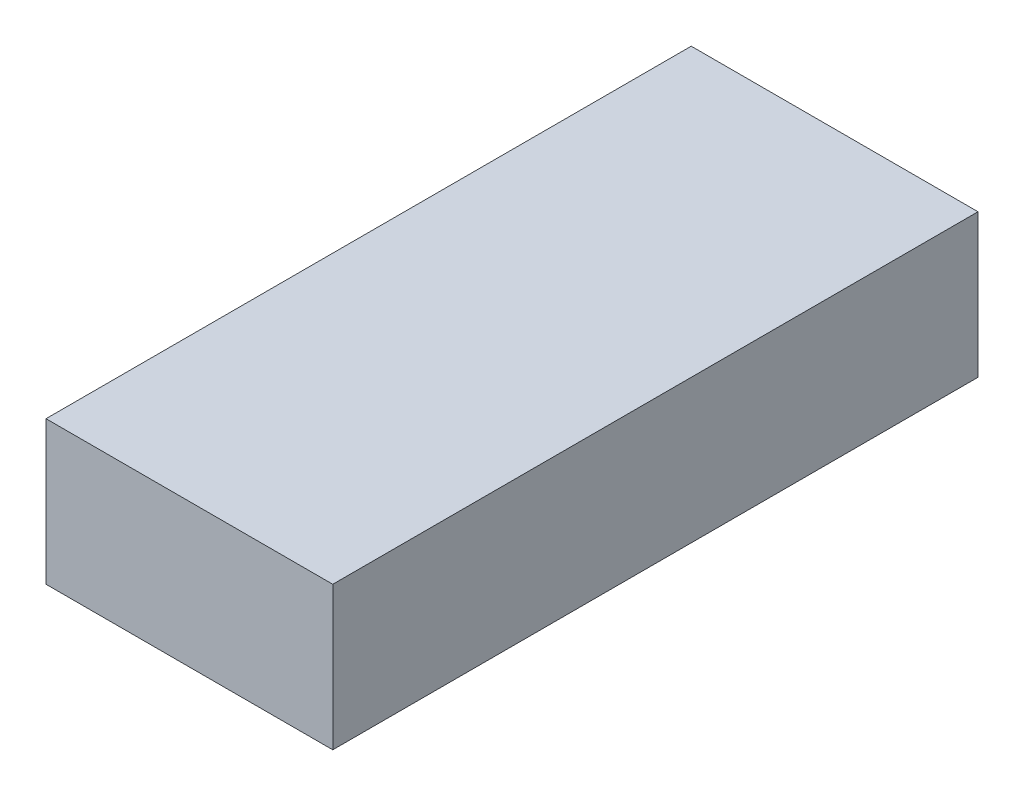
ISO-10303-21;
HEADER;
FILE_DESCRIPTION(('STEP AP214'),'2;1');
FILE_NAME('part.step','',(''),(''),'','','');
FILE_SCHEMA(('AUTOMOTIVE_DESIGN { 1 0 10303 214 1 1 1 1 }'));
ENDSEC;
DATA;
#1=APPLICATION_CONTEXT('core data for automotive mechanical design processes');
#2=APPLICATION_PROTOCOL_DEFINITION('international standard','automotive_design',2000,#1);
#3=PRODUCT_CONTEXT('',#1,'mechanical');
#4=PRODUCT('Part','Part','',(#3));
#5=PRODUCT_RELATED_PRODUCT_CATEGORY('part','',(#4));
#6=PRODUCT_DEFINITION_FORMATION('','',#4);
#7=PRODUCT_DEFINITION_CONTEXT('part definition',#1,'design');
#8=PRODUCT_DEFINITION('design','',#6,#7);
#9=PRODUCT_DEFINITION_SHAPE('','',#8);
#10=(LENGTH_UNIT() NAMED_UNIT(*) SI_UNIT(.MILLI.,.METRE.));
#11=(NAMED_UNIT(*) PLANE_ANGLE_UNIT() SI_UNIT($,.RADIAN.));
#12=(NAMED_UNIT(*) SI_UNIT($,.STERADIAN.) SOLID_ANGLE_UNIT());
#13=UNCERTAINTY_MEASURE_WITH_UNIT(LENGTH_MEASURE(1.E-05),#10,'distance_accuracy_value','');
#14=(GEOMETRIC_REPRESENTATION_CONTEXT(3) GLOBAL_UNCERTAINTY_ASSIGNED_CONTEXT((#13)) GLOBAL_UNIT_ASSIGNED_CONTEXT((#10,
#11,#12)) REPRESENTATION_CONTEXT('',''));
#15=CARTESIAN_POINT('',(0.,0.,0.));
#16=DIRECTION('',(0.,0.,1.));
#17=DIRECTION('',(1.,0.,0.));
#18=AXIS2_PLACEMENT_3D('',#15,#16,#17);
#19=CARTESIAN_POINT('',(0.,10.,0.));
#20=DIRECTION('',(1.,0.,0.));
#21=DIRECTION('',(0.,0.,-1.));
#22=AXIS2_PLACEMENT_3D('',#19,#20,#21);
#23=PLANE('',#22);
#24=DIRECTION('',(0.,0.,1.));
#25=VECTOR('',#24,1.);
#26=CARTESIAN_POINT('',(0.,0.,0.));
#27=LINE('',#26,#25);
#28=CARTESIAN_POINT('',(0.,0.,-45.));
#29=VERTEX_POINT('',#28);
#30=CARTESIAN_POINT('',(0.,0.,0.));
#31=VERTEX_POINT('',#30);
#32=EDGE_CURVE('E100',#29,#31,#27,.T.);
#33=ORIENTED_EDGE('',*,*,#32,.T.);
#34=DIRECTION('',(0.,-1.,0.));
#35=VECTOR('',#34,1.);
#36=CARTESIAN_POINT('',(0.,10.,0.));
#37=LINE('',#36,#35);
#38=CARTESIAN_POINT('',(0.,10.,0.));
#39=VERTEX_POINT('',#38);
#40=EDGE_CURVE('E11',#39,#31,#37,.T.);
#41=ORIENTED_EDGE('',*,*,#40,.F.);
#42=DIRECTION('',(0.,0.,1.));
#43=VECTOR('',#42,1.);
#44=CARTESIAN_POINT('',(0.,10.,0.));
#45=LINE('',#44,#43);
#46=CARTESIAN_POINT('',(0.,10.,-45.));
#47=VERTEX_POINT('',#46);
#48=EDGE_CURVE('E88',#47,#39,#45,.T.);
#49=ORIENTED_EDGE('',*,*,#48,.F.);
#50=DIRECTION('',(0.,-1.,0.));
#51=VECTOR('',#50,1.);
#52=CARTESIAN_POINT('',(0.,10.,-45.));
#53=LINE('',#52,#51);
#54=EDGE_CURVE('E96',#47,#29,#53,.T.);
#55=ORIENTED_EDGE('',*,*,#54,.T.);
#56=EDGE_LOOP('',(#33,#41,#49,#55));
#57=FACE_BOUND('',#56,.T.);
#58=ADVANCED_FACE('F37',(#57),#23,.F.);
#59=CARTESIAN_POINT('',(0.,10.,0.));
#60=DIRECTION('',(0.,0.,-1.));
#61=DIRECTION('',(-1.,0.,0.));
#62=AXIS2_PLACEMENT_3D('',#59,#60,#61);
#63=PLANE('',#62);
#64=DIRECTION('',(1.,0.,0.));
#65=VECTOR('',#64,1.);
#66=CARTESIAN_POINT('',(0.,0.,0.));
#67=LINE('',#66,#65);
#68=CARTESIAN_POINT('',(20.,0.,0.));
#69=VERTEX_POINT('',#68);
#70=EDGE_CURVE('E92',#31,#69,#67,.T.);
#71=ORIENTED_EDGE('',*,*,#70,.T.);
#72=DIRECTION('',(0.,-1.,0.));
#73=VECTOR('',#72,1.);
#74=CARTESIAN_POINT('',(20.,10.,0.));
#75=LINE('',#74,#73);
#76=CARTESIAN_POINT('',(20.,10.,0.));
#77=VERTEX_POINT('',#76);
#78=EDGE_CURVE('E45',#77,#69,#75,.T.);
#79=ORIENTED_EDGE('',*,*,#78,.F.);
#80=DIRECTION('',(1.,0.,0.));
#81=VECTOR('',#80,1.);
#82=CARTESIAN_POINT('',(0.,10.,0.));
#83=LINE('',#82,#81);
#84=EDGE_CURVE('E83',#39,#77,#83,.T.);
#85=ORIENTED_EDGE('',*,*,#84,.F.);
#86=ORIENTED_EDGE('',*,*,#40,.T.);
#87=EDGE_LOOP('',(#71,#79,#85,#86));
#88=FACE_BOUND('',#87,.T.);
#89=ADVANCED_FACE('F91',(#88),#63,.F.);
#90=CARTESIAN_POINT('',(20.,10.,0.));
#91=DIRECTION('',(-1.,0.,0.));
#92=DIRECTION('',(0.,0.,1.));
#93=AXIS2_PLACEMENT_3D('',#90,#91,#92);
#94=PLANE('',#93);
#95=DIRECTION('',(0.,0.,-1.));
#96=VECTOR('',#95,1.);
#97=CARTESIAN_POINT('',(20.,0.,0.));
#98=LINE('',#97,#96);
#99=CARTESIAN_POINT('',(20.,0.,-45.));
#100=VERTEX_POINT('',#99);
#101=EDGE_CURVE('E70',#69,#100,#98,.T.);
#102=ORIENTED_EDGE('',*,*,#101,.T.);
#103=DIRECTION('',(0.,-1.,0.));
#104=VECTOR('',#103,1.);
#105=CARTESIAN_POINT('',(20.,10.,-45.));
#106=LINE('',#105,#104);
#107=CARTESIAN_POINT('',(20.,10.,-45.));
#108=VERTEX_POINT('',#107);
#109=EDGE_CURVE('E93',#108,#100,#106,.T.);
#110=ORIENTED_EDGE('',*,*,#109,.F.);
#111=DIRECTION('',(0.,0.,-1.));
#112=VECTOR('',#111,1.);
#113=CARTESIAN_POINT('',(20.,10.,0.));
#114=LINE('',#113,#112);
#115=EDGE_CURVE('E86',#77,#108,#114,.T.);
#116=ORIENTED_EDGE('',*,*,#115,.F.);
#117=ORIENTED_EDGE('',*,*,#78,.T.);
#118=EDGE_LOOP('',(#102,#110,#116,#117));
#119=FACE_BOUND('',#118,.T.);
#120=ADVANCED_FACE('F94',(#119),#94,.F.);
#121=CARTESIAN_POINT('',(0.,10.,-45.));
#122=DIRECTION('',(0.,0.,1.));
#123=DIRECTION('',(1.,0.,0.));
#124=AXIS2_PLACEMENT_3D('',#121,#122,#123);
#125=PLANE('',#124);
#126=DIRECTION('',(-1.,0.,0.));
#127=VECTOR('',#126,1.);
#128=CARTESIAN_POINT('',(0.,0.,-45.));
#129=LINE('',#128,#127);
#130=EDGE_CURVE('E76',#100,#29,#129,.T.);
#131=ORIENTED_EDGE('',*,*,#130,.T.);
#132=ORIENTED_EDGE('',*,*,#54,.F.);
#133=DIRECTION('',(-1.,0.,0.));
#134=VECTOR('',#133,1.);
#135=CARTESIAN_POINT('',(0.,10.,-45.));
#136=LINE('',#135,#134);
#137=EDGE_CURVE('E53',#108,#47,#136,.T.);
#138=ORIENTED_EDGE('',*,*,#137,.F.);
#139=ORIENTED_EDGE('',*,*,#109,.T.);
#140=EDGE_LOOP('',(#131,#132,#138,#139));
#141=FACE_BOUND('',#140,.T.);
#142=ADVANCED_FACE('F107',(#141),#125,.F.);
#143=CARTESIAN_POINT('',(0.,10.,0.));
#144=DIRECTION('',(0.,-1.,0.));
#145=DIRECTION('',(0.,0.,-1.));
#146=AXIS2_PLACEMENT_3D('',#143,#144,#145);
#147=PLANE('',#146);
#148=ORIENTED_EDGE('',*,*,#48,.T.);
#149=ORIENTED_EDGE('',*,*,#84,.T.);
#150=ORIENTED_EDGE('',*,*,#115,.T.);
#151=ORIENTED_EDGE('',*,*,#137,.T.);
#152=EDGE_LOOP('',(#148,#149,#150,#151));
#153=FACE_BOUND('',#152,.T.);
#154=ADVANCED_FACE('F84',(#153),#147,.F.);
#155=CARTESIAN_POINT('',(0.,0.,0.));
#156=DIRECTION('',(0.,-1.,0.));
#157=DIRECTION('',(0.,0.,-1.));
#158=AXIS2_PLACEMENT_3D('',#155,#156,#157);
#159=PLANE('',#158);
#160=ORIENTED_EDGE('',*,*,#32,.F.);
#161=ORIENTED_EDGE('',*,*,#130,.F.);
#162=ORIENTED_EDGE('',*,*,#101,.F.);
#163=ORIENTED_EDGE('',*,*,#70,.F.);
#164=EDGE_LOOP('',(#160,#161,#162,#163));
#165=FACE_BOUND('',#164,.T.);
#166=ADVANCED_FACE('F110',(#165),#159,.T.);
#167=CLOSED_SHELL('',(#58,#89,#120,#142,#154,#166));
#168=MANIFOLD_SOLID_BREP('B2',#167);
#169=ADVANCED_BREP_SHAPE_REPRESENTATION('',(#18,#168),#14);
#170=SHAPE_DEFINITION_REPRESENTATION(#9,#169);
ENDSEC;
END-ISO-10303-21;
